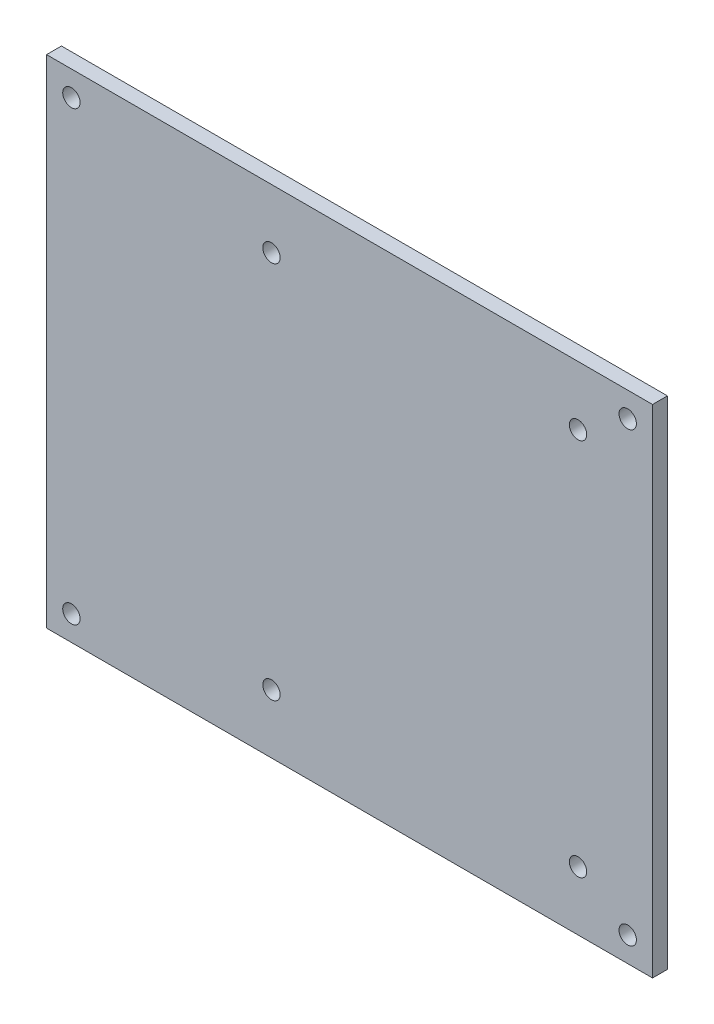
ISO-10303-21;
HEADER;
FILE_DESCRIPTION(('STEP AP214'),'2;1');
FILE_NAME('part.step','',(''),(''),'','','');
FILE_SCHEMA(('AUTOMOTIVE_DESIGN { 1 0 10303 214 1 1 1 1 }'));
ENDSEC;
DATA;
#1=APPLICATION_CONTEXT('core data for automotive mechanical design processes');
#2=APPLICATION_PROTOCOL_DEFINITION('international standard','automotive_design',2000,#1);
#3=PRODUCT_CONTEXT('',#1,'mechanical');
#4=PRODUCT('Part','Part','',(#3));
#5=PRODUCT_RELATED_PRODUCT_CATEGORY('part','',(#4));
#6=PRODUCT_DEFINITION_FORMATION('','',#4);
#7=PRODUCT_DEFINITION_CONTEXT('part definition',#1,'design');
#8=PRODUCT_DEFINITION('design','',#6,#7);
#9=PRODUCT_DEFINITION_SHAPE('','',#8);
#10=(LENGTH_UNIT() NAMED_UNIT(*) SI_UNIT(.MILLI.,.METRE.));
#11=(NAMED_UNIT(*) PLANE_ANGLE_UNIT() SI_UNIT($,.RADIAN.));
#12=(NAMED_UNIT(*) SI_UNIT($,.STERADIAN.) SOLID_ANGLE_UNIT());
#13=UNCERTAINTY_MEASURE_WITH_UNIT(LENGTH_MEASURE(1.E-05),#10,'distance_accuracy_value','');
#14=(GEOMETRIC_REPRESENTATION_CONTEXT(3) GLOBAL_UNCERTAINTY_ASSIGNED_CONTEXT((#13)) GLOBAL_UNIT_ASSIGNED_CONTEXT((#10,
#11,#12)) REPRESENTATION_CONTEXT('',''));
#15=CARTESIAN_POINT('',(0.,0.,0.));
#16=DIRECTION('',(0.,0.,1.));
#17=DIRECTION('',(1.,0.,0.));
#18=AXIS2_PLACEMENT_3D('',#15,#16,#17);
#19=CARTESIAN_POINT('',(0.,0.,3.));
#20=DIRECTION('',(0.,0.,1.));
#21=DIRECTION('',(1.,0.,0.));
#22=AXIS2_PLACEMENT_3D('',#19,#20,#21);
#23=PLANE('',#22);
#24=CARTESIAN_POINT('',(-15.72,38.1,3.));
#25=DIRECTION('',(0.,0.,1.));
#26=DIRECTION('',(1.,0.,0.));
#27=AXIS2_PLACEMENT_3D('',#24,#25,#26);
#28=CIRCLE('',#27,1.75);
#29=CARTESIAN_POINT('',(-13.97,38.1,3.));
#30=VERTEX_POINT('',#29);
#31=EDGE_CURVE('E151',#30,#30,#28,.T.);
#32=ORIENTED_EDGE('',*,*,#31,.F.);
#33=EDGE_LOOP('',(#32));
#34=FACE_BOUND('',#33,.T.);
#35=CARTESIAN_POINT('',(46.,38.1,3.));
#36=DIRECTION('',(0.,0.,1.));
#37=DIRECTION('',(1.,0.,0.));
#38=AXIS2_PLACEMENT_3D('',#35,#36,#37);
#39=CIRCLE('',#38,1.75);
#40=CARTESIAN_POINT('',(47.75,38.1,3.));
#41=VERTEX_POINT('',#40);
#42=EDGE_CURVE('E137',#41,#41,#39,.T.);
#43=ORIENTED_EDGE('',*,*,#42,.F.);
#44=EDGE_LOOP('',(#43));
#45=FACE_BOUND('',#44,.T.);
#46=CARTESIAN_POINT('',(56.,-45.,3.));
#47=DIRECTION('',(0.,0.,1.));
#48=DIRECTION('',(1.,0.,0.));
#49=AXIS2_PLACEMENT_3D('',#46,#47,#48);
#50=CIRCLE('',#49,1.75);
#51=CARTESIAN_POINT('',(57.75,-45.,3.));
#52=VERTEX_POINT('',#51);
#53=EDGE_CURVE('E130',#52,#52,#50,.T.);
#54=ORIENTED_EDGE('',*,*,#53,.F.);
#55=EDGE_LOOP('',(#54));
#56=FACE_BOUND('',#55,.T.);
#57=CARTESIAN_POINT('',(-56.,-45.,3.));
#58=DIRECTION('',(0.,0.,1.));
#59=DIRECTION('',(1.,0.,0.));
#60=AXIS2_PLACEMENT_3D('',#57,#58,#59);
#61=CIRCLE('',#60,1.75);
#62=CARTESIAN_POINT('',(-54.25,-45.,3.));
#63=VERTEX_POINT('',#62);
#64=EDGE_CURVE('E106',#63,#63,#61,.T.);
#65=ORIENTED_EDGE('',*,*,#64,.F.);
#66=EDGE_LOOP('',(#65));
#67=FACE_BOUND('',#66,.T.);
#68=DIRECTION('',(1.,0.,0.));
#69=VECTOR('',#68,1.);
#70=CARTESIAN_POINT('',(61.,-50.,3.));
#71=LINE('',#70,#69);
#72=CARTESIAN_POINT('',(-61.,-50.,3.));
#73=VERTEX_POINT('',#72);
#74=CARTESIAN_POINT('',(61.,-50.,3.));
#75=VERTEX_POINT('',#74);
#76=EDGE_CURVE('E91',#73,#75,#71,.T.);
#77=ORIENTED_EDGE('',*,*,#76,.T.);
#78=DIRECTION('',(0.,1.,0.));
#79=VECTOR('',#78,1.);
#80=CARTESIAN_POINT('',(61.,50.,3.));
#81=LINE('',#80,#79);
#82=CARTESIAN_POINT('',(61.,50.,3.));
#83=VERTEX_POINT('',#82);
#84=EDGE_CURVE('E86',#75,#83,#81,.T.);
#85=ORIENTED_EDGE('',*,*,#84,.T.);
#86=DIRECTION('',(-1.,0.,0.));
#87=VECTOR('',#86,1.);
#88=CARTESIAN_POINT('',(61.,50.,3.));
#89=LINE('',#88,#87);
#90=CARTESIAN_POINT('',(-61.,50.,3.));
#91=VERTEX_POINT('',#90);
#92=EDGE_CURVE('E87',#83,#91,#89,.T.);
#93=ORIENTED_EDGE('',*,*,#92,.T.);
#94=DIRECTION('',(0.,-1.,0.));
#95=VECTOR('',#94,1.);
#96=CARTESIAN_POINT('',(-61.,50.,3.));
#97=LINE('',#96,#95);
#98=EDGE_CURVE('E57',#91,#73,#97,.T.);
#99=ORIENTED_EDGE('',*,*,#98,.T.);
#100=EDGE_LOOP('',(#77,#85,#93,#99));
#101=FACE_BOUND('',#100,.T.);
#102=CARTESIAN_POINT('',(-56.,45.,3.));
#103=DIRECTION('',(0.,0.,1.));
#104=DIRECTION('',(1.,0.,0.));
#105=AXIS2_PLACEMENT_3D('',#102,#103,#104);
#106=CIRCLE('',#105,1.75);
#107=CARTESIAN_POINT('',(-54.25,45.,3.));
#108=VERTEX_POINT('',#107);
#109=EDGE_CURVE('E123',#108,#108,#106,.T.);
#110=ORIENTED_EDGE('',*,*,#109,.F.);
#111=EDGE_LOOP('',(#110));
#112=FACE_BOUND('',#111,.T.);
#113=CARTESIAN_POINT('',(56.,45.,3.));
#114=DIRECTION('',(0.,0.,1.));
#115=DIRECTION('',(1.,0.,0.));
#116=AXIS2_PLACEMENT_3D('',#113,#114,#115);
#117=CIRCLE('',#116,1.75);
#118=CARTESIAN_POINT('',(57.75,45.,3.));
#119=VERTEX_POINT('',#118);
#120=EDGE_CURVE('E133',#119,#119,#117,.T.);
#121=ORIENTED_EDGE('',*,*,#120,.F.);
#122=EDGE_LOOP('',(#121));
#123=FACE_BOUND('',#122,.T.);
#124=CARTESIAN_POINT('',(-15.72,-38.1,3.));
#125=DIRECTION('',(0.,0.,1.));
#126=DIRECTION('',(1.,0.,0.));
#127=AXIS2_PLACEMENT_3D('',#124,#125,#126);
#128=CIRCLE('',#127,1.75);
#129=CARTESIAN_POINT('',(-13.97,-38.1,3.));
#130=VERTEX_POINT('',#129);
#131=EDGE_CURVE('E144',#130,#130,#128,.T.);
#132=ORIENTED_EDGE('',*,*,#131,.F.);
#133=EDGE_LOOP('',(#132));
#134=FACE_BOUND('',#133,.T.);
#135=CARTESIAN_POINT('',(46.,-38.1,3.));
#136=DIRECTION('',(0.,0.,1.));
#137=DIRECTION('',(1.,0.,0.));
#138=AXIS2_PLACEMENT_3D('',#135,#136,#137);
#139=CIRCLE('',#138,1.75);
#140=CARTESIAN_POINT('',(47.75,-38.1,3.));
#141=VERTEX_POINT('',#140);
#142=EDGE_CURVE('E160',#141,#141,#139,.T.);
#143=ORIENTED_EDGE('',*,*,#142,.F.);
#144=EDGE_LOOP('',(#143));
#145=FACE_BOUND('',#144,.T.);
#146=ADVANCED_FACE('F39',(#34,#45,#56,#67,#101,#112,#123,#134,#145),#23,.T.);
#147=CARTESIAN_POINT('',(0.,0.,0.));
#148=DIRECTION('',(0.,0.,1.));
#149=DIRECTION('',(1.,0.,0.));
#150=AXIS2_PLACEMENT_3D('',#147,#148,#149);
#151=PLANE('',#150);
#152=DIRECTION('',(1.,0.,0.));
#153=VECTOR('',#152,1.);
#154=CARTESIAN_POINT('',(61.,-50.,0.));
#155=LINE('',#154,#153);
#156=CARTESIAN_POINT('',(-61.,-50.,0.));
#157=VERTEX_POINT('',#156);
#158=CARTESIAN_POINT('',(61.,-50.,0.));
#159=VERTEX_POINT('',#158);
#160=EDGE_CURVE('E104',#157,#159,#155,.T.);
#161=ORIENTED_EDGE('',*,*,#160,.F.);
#162=DIRECTION('',(0.,-1.,0.));
#163=VECTOR('',#162,1.);
#164=CARTESIAN_POINT('',(-61.,50.,0.));
#165=LINE('',#164,#163);
#166=CARTESIAN_POINT('',(-61.,50.,0.));
#167=VERTEX_POINT('',#166);
#168=EDGE_CURVE('E80',#167,#157,#165,.T.);
#169=ORIENTED_EDGE('',*,*,#168,.F.);
#170=DIRECTION('',(-1.,0.,0.));
#171=VECTOR('',#170,1.);
#172=CARTESIAN_POINT('',(61.,50.,0.));
#173=LINE('',#172,#171);
#174=CARTESIAN_POINT('',(61.,50.,0.));
#175=VERTEX_POINT('',#174);
#176=EDGE_CURVE('E74',#175,#167,#173,.T.);
#177=ORIENTED_EDGE('',*,*,#176,.F.);
#178=DIRECTION('',(0.,1.,0.));
#179=VECTOR('',#178,1.);
#180=CARTESIAN_POINT('',(61.,50.,0.));
#181=LINE('',#180,#179);
#182=EDGE_CURVE('E94',#159,#175,#181,.T.);
#183=ORIENTED_EDGE('',*,*,#182,.F.);
#184=EDGE_LOOP('',(#161,#169,#177,#183));
#185=FACE_BOUND('',#184,.T.);
#186=CARTESIAN_POINT('',(-56.,-45.,0.));
#187=DIRECTION('',(0.,0.,1.));
#188=DIRECTION('',(1.,0.,0.));
#189=AXIS2_PLACEMENT_3D('',#186,#187,#188);
#190=CIRCLE('',#189,1.75);
#191=CARTESIAN_POINT('',(-54.25,-45.,0.));
#192=VERTEX_POINT('',#191);
#193=EDGE_CURVE('E119',#192,#192,#190,.T.);
#194=ORIENTED_EDGE('',*,*,#193,.T.);
#195=EDGE_LOOP('',(#194));
#196=FACE_BOUND('',#195,.T.);
#197=CARTESIAN_POINT('',(-56.,45.,0.));
#198=DIRECTION('',(0.,0.,1.));
#199=DIRECTION('',(1.,0.,0.));
#200=AXIS2_PLACEMENT_3D('',#197,#198,#199);
#201=CIRCLE('',#200,1.75);
#202=CARTESIAN_POINT('',(-54.25,45.,0.));
#203=VERTEX_POINT('',#202);
#204=EDGE_CURVE('E125',#203,#203,#201,.T.);
#205=ORIENTED_EDGE('',*,*,#204,.T.);
#206=EDGE_LOOP('',(#205));
#207=FACE_BOUND('',#206,.T.);
#208=CARTESIAN_POINT('',(56.,-45.,0.));
#209=DIRECTION('',(0.,0.,1.));
#210=DIRECTION('',(1.,0.,0.));
#211=AXIS2_PLACEMENT_3D('',#208,#209,#210);
#212=CIRCLE('',#211,1.75);
#213=CARTESIAN_POINT('',(57.75,-45.,0.));
#214=VERTEX_POINT('',#213);
#215=EDGE_CURVE('E127',#214,#214,#212,.T.);
#216=ORIENTED_EDGE('',*,*,#215,.T.);
#217=EDGE_LOOP('',(#216));
#218=FACE_BOUND('',#217,.T.);
#219=CARTESIAN_POINT('',(56.,45.,0.));
#220=DIRECTION('',(0.,0.,1.));
#221=DIRECTION('',(1.,0.,0.));
#222=AXIS2_PLACEMENT_3D('',#219,#220,#221);
#223=CIRCLE('',#222,1.75);
#224=CARTESIAN_POINT('',(57.75,45.,0.));
#225=VERTEX_POINT('',#224);
#226=EDGE_CURVE('E136',#225,#225,#223,.T.);
#227=ORIENTED_EDGE('',*,*,#226,.T.);
#228=EDGE_LOOP('',(#227));
#229=FACE_BOUND('',#228,.T.);
#230=CARTESIAN_POINT('',(46.,38.1,0.));
#231=DIRECTION('',(0.,0.,1.));
#232=DIRECTION('',(1.,0.,0.));
#233=AXIS2_PLACEMENT_3D('',#230,#231,#232);
#234=CIRCLE('',#233,1.75);
#235=CARTESIAN_POINT('',(47.75,38.1,0.));
#236=VERTEX_POINT('',#235);
#237=EDGE_CURVE('E145',#236,#236,#234,.T.);
#238=ORIENTED_EDGE('',*,*,#237,.T.);
#239=EDGE_LOOP('',(#238));
#240=FACE_BOUND('',#239,.T.);
#241=CARTESIAN_POINT('',(-15.72,-38.1,0.));
#242=DIRECTION('',(0.,0.,1.));
#243=DIRECTION('',(1.,0.,0.));
#244=AXIS2_PLACEMENT_3D('',#241,#242,#243);
#245=CIRCLE('',#244,1.75);
#246=CARTESIAN_POINT('',(-13.97,-38.1,0.));
#247=VERTEX_POINT('',#246);
#248=EDGE_CURVE('E149',#247,#247,#245,.T.);
#249=ORIENTED_EDGE('',*,*,#248,.T.);
#250=EDGE_LOOP('',(#249));
#251=FACE_BOUND('',#250,.T.);
#252=CARTESIAN_POINT('',(-15.72,38.1,0.));
#253=DIRECTION('',(0.,0.,1.));
#254=DIRECTION('',(1.,0.,0.));
#255=AXIS2_PLACEMENT_3D('',#252,#253,#254);
#256=CIRCLE('',#255,1.75);
#257=CARTESIAN_POINT('',(-13.97,38.1,0.));
#258=VERTEX_POINT('',#257);
#259=EDGE_CURVE('E153',#258,#258,#256,.T.);
#260=ORIENTED_EDGE('',*,*,#259,.T.);
#261=EDGE_LOOP('',(#260));
#262=FACE_BOUND('',#261,.T.);
#263=CARTESIAN_POINT('',(46.,-38.1,0.));
#264=DIRECTION('',(0.,0.,1.));
#265=DIRECTION('',(1.,0.,0.));
#266=AXIS2_PLACEMENT_3D('',#263,#264,#265);
#267=CIRCLE('',#266,1.75);
#268=CARTESIAN_POINT('',(47.75,-38.1,0.));
#269=VERTEX_POINT('',#268);
#270=EDGE_CURVE('E158',#269,#269,#267,.T.);
#271=ORIENTED_EDGE('',*,*,#270,.T.);
#272=EDGE_LOOP('',(#271));
#273=FACE_BOUND('',#272,.T.);
#274=ADVANCED_FACE('F114',(#185,#196,#207,#218,#229,#240,#251,#262,#273),#151,.F.);
#275=CARTESIAN_POINT('',(61.,-50.,3.));
#276=DIRECTION('',(0.,1.,0.));
#277=DIRECTION('',(0.,0.,1.));
#278=AXIS2_PLACEMENT_3D('',#275,#276,#277);
#279=PLANE('',#278);
#280=ORIENTED_EDGE('',*,*,#160,.T.);
#281=DIRECTION('',(0.,0.,-1.));
#282=VECTOR('',#281,1.);
#283=CARTESIAN_POINT('',(61.,-50.,3.));
#284=LINE('',#283,#282);
#285=EDGE_CURVE('E11',#75,#159,#284,.T.);
#286=ORIENTED_EDGE('',*,*,#285,.F.);
#287=ORIENTED_EDGE('',*,*,#76,.F.);
#288=DIRECTION('',(0.,0.,-1.));
#289=VECTOR('',#288,1.);
#290=CARTESIAN_POINT('',(-61.,-50.,3.));
#291=LINE('',#290,#289);
#292=EDGE_CURVE('E98',#73,#157,#291,.T.);
#293=ORIENTED_EDGE('',*,*,#292,.T.);
#294=EDGE_LOOP('',(#280,#286,#287,#293));
#295=FACE_BOUND('',#294,.T.);
#296=ADVANCED_FACE('F41',(#295),#279,.F.);
#297=CARTESIAN_POINT('',(61.,50.,3.));
#298=DIRECTION('',(-1.,0.,0.));
#299=DIRECTION('',(0.,-1.,0.));
#300=AXIS2_PLACEMENT_3D('',#297,#298,#299);
#301=PLANE('',#300);
#302=ORIENTED_EDGE('',*,*,#182,.T.);
#303=DIRECTION('',(0.,0.,-1.));
#304=VECTOR('',#303,1.);
#305=CARTESIAN_POINT('',(61.,50.,3.));
#306=LINE('',#305,#304);
#307=EDGE_CURVE('E48',#83,#175,#306,.T.);
#308=ORIENTED_EDGE('',*,*,#307,.F.);
#309=ORIENTED_EDGE('',*,*,#84,.F.);
#310=ORIENTED_EDGE('',*,*,#285,.T.);
#311=EDGE_LOOP('',(#302,#308,#309,#310));
#312=FACE_BOUND('',#311,.T.);
#313=ADVANCED_FACE('F92',(#312),#301,.F.);
#314=CARTESIAN_POINT('',(61.,50.,3.));
#315=DIRECTION('',(0.,-1.,0.));
#316=DIRECTION('',(0.,0.,-1.));
#317=AXIS2_PLACEMENT_3D('',#314,#315,#316);
#318=PLANE('',#317);
#319=ORIENTED_EDGE('',*,*,#176,.T.);
#320=DIRECTION('',(0.,0.,-1.));
#321=VECTOR('',#320,1.);
#322=CARTESIAN_POINT('',(-61.,50.,3.));
#323=LINE('',#322,#321);
#324=EDGE_CURVE('E96',#91,#167,#323,.T.);
#325=ORIENTED_EDGE('',*,*,#324,.F.);
#326=ORIENTED_EDGE('',*,*,#92,.F.);
#327=ORIENTED_EDGE('',*,*,#307,.T.);
#328=EDGE_LOOP('',(#319,#325,#326,#327));
#329=FACE_BOUND('',#328,.T.);
#330=ADVANCED_FACE('F100',(#329),#318,.F.);
#331=CARTESIAN_POINT('',(-61.,50.,3.));
#332=DIRECTION('',(1.,0.,0.));
#333=DIRECTION('',(0.,1.,0.));
#334=AXIS2_PLACEMENT_3D('',#331,#332,#333);
#335=PLANE('',#334);
#336=ORIENTED_EDGE('',*,*,#168,.T.);
#337=ORIENTED_EDGE('',*,*,#292,.F.);
#338=ORIENTED_EDGE('',*,*,#98,.F.);
#339=ORIENTED_EDGE('',*,*,#324,.T.);
#340=EDGE_LOOP('',(#336,#337,#338,#339));
#341=FACE_BOUND('',#340,.T.);
#342=ADVANCED_FACE('F112',(#341),#335,.F.);
#343=CARTESIAN_POINT('',(-56.,-45.,3.));
#344=DIRECTION('',(0.,0.,-1.));
#345=DIRECTION('',(-1.,0.,0.));
#346=AXIS2_PLACEMENT_3D('',#343,#344,#345);
#347=CYLINDRICAL_SURFACE('',#346,1.75);
#348=ORIENTED_EDGE('',*,*,#64,.T.);
#349=EDGE_LOOP('',(#348));
#350=FACE_BOUND('',#349,.T.);
#351=ORIENTED_EDGE('',*,*,#193,.F.);
#352=EDGE_LOOP('',(#351));
#353=FACE_BOUND('',#352,.T.);
#354=ADVANCED_FACE('F177',(#350,#353),#347,.F.);
#355=CARTESIAN_POINT('',(-56.,45.,3.));
#356=DIRECTION('',(0.,0.,-1.));
#357=DIRECTION('',(-1.,0.,0.));
#358=AXIS2_PLACEMENT_3D('',#355,#356,#357);
#359=CYLINDRICAL_SURFACE('',#358,1.75);
#360=ORIENTED_EDGE('',*,*,#109,.T.);
#361=EDGE_LOOP('',(#360));
#362=FACE_BOUND('',#361,.T.);
#363=ORIENTED_EDGE('',*,*,#204,.F.);
#364=EDGE_LOOP('',(#363));
#365=FACE_BOUND('',#364,.T.);
#366=ADVANCED_FACE('F222',(#362,#365),#359,.F.);
#367=CARTESIAN_POINT('',(56.,-45.,3.));
#368=DIRECTION('',(0.,0.,-1.));
#369=DIRECTION('',(-1.,0.,0.));
#370=AXIS2_PLACEMENT_3D('',#367,#368,#369);
#371=CYLINDRICAL_SURFACE('',#370,1.75);
#372=ORIENTED_EDGE('',*,*,#53,.T.);
#373=EDGE_LOOP('',(#372));
#374=FACE_BOUND('',#373,.T.);
#375=ORIENTED_EDGE('',*,*,#215,.F.);
#376=EDGE_LOOP('',(#375));
#377=FACE_BOUND('',#376,.T.);
#378=ADVANCED_FACE('F235',(#374,#377),#371,.F.);
#379=CARTESIAN_POINT('',(56.,45.,3.));
#380=DIRECTION('',(0.,0.,-1.));
#381=DIRECTION('',(-1.,0.,0.));
#382=AXIS2_PLACEMENT_3D('',#379,#380,#381);
#383=CYLINDRICAL_SURFACE('',#382,1.75);
#384=ORIENTED_EDGE('',*,*,#120,.T.);
#385=EDGE_LOOP('',(#384));
#386=FACE_BOUND('',#385,.T.);
#387=ORIENTED_EDGE('',*,*,#226,.F.);
#388=EDGE_LOOP('',(#387));
#389=FACE_BOUND('',#388,.T.);
#390=ADVANCED_FACE('F238',(#386,#389),#383,.F.);
#391=CARTESIAN_POINT('',(46.,38.1,3.));
#392=DIRECTION('',(0.,0.,-1.));
#393=DIRECTION('',(-1.,0.,0.));
#394=AXIS2_PLACEMENT_3D('',#391,#392,#393);
#395=CYLINDRICAL_SURFACE('',#394,1.75);
#396=ORIENTED_EDGE('',*,*,#42,.T.);
#397=EDGE_LOOP('',(#396));
#398=FACE_BOUND('',#397,.T.);
#399=ORIENTED_EDGE('',*,*,#237,.F.);
#400=EDGE_LOOP('',(#399));
#401=FACE_BOUND('',#400,.T.);
#402=ADVANCED_FACE('F249',(#398,#401),#395,.F.);
#403=CARTESIAN_POINT('',(-15.72,-38.1,3.));
#404=DIRECTION('',(0.,0.,-1.));
#405=DIRECTION('',(-1.,0.,0.));
#406=AXIS2_PLACEMENT_3D('',#403,#404,#405);
#407=CYLINDRICAL_SURFACE('',#406,1.75);
#408=ORIENTED_EDGE('',*,*,#131,.T.);
#409=EDGE_LOOP('',(#408));
#410=FACE_BOUND('',#409,.T.);
#411=ORIENTED_EDGE('',*,*,#248,.F.);
#412=EDGE_LOOP('',(#411));
#413=FACE_BOUND('',#412,.T.);
#414=ADVANCED_FACE('F256',(#410,#413),#407,.F.);
#415=CARTESIAN_POINT('',(-15.72,38.1,3.));
#416=DIRECTION('',(0.,0.,-1.));
#417=DIRECTION('',(-1.,0.,0.));
#418=AXIS2_PLACEMENT_3D('',#415,#416,#417);
#419=CYLINDRICAL_SURFACE('',#418,1.75);
#420=ORIENTED_EDGE('',*,*,#31,.T.);
#421=EDGE_LOOP('',(#420));
#422=FACE_BOUND('',#421,.T.);
#423=ORIENTED_EDGE('',*,*,#259,.F.);
#424=EDGE_LOOP('',(#423));
#425=FACE_BOUND('',#424,.T.);
#426=ADVANCED_FACE('F270',(#422,#425),#419,.F.);
#427=CARTESIAN_POINT('',(46.,-38.1,3.));
#428=DIRECTION('',(0.,0.,-1.));
#429=DIRECTION('',(-1.,0.,0.));
#430=AXIS2_PLACEMENT_3D('',#427,#428,#429);
#431=CYLINDRICAL_SURFACE('',#430,1.75);
#432=ORIENTED_EDGE('',*,*,#142,.T.);
#433=EDGE_LOOP('',(#432));
#434=FACE_BOUND('',#433,.T.);
#435=ORIENTED_EDGE('',*,*,#270,.F.);
#436=EDGE_LOOP('',(#435));
#437=FACE_BOUND('',#436,.T.);
#438=ADVANCED_FACE('F168',(#434,#437),#431,.F.);
#439=CLOSED_SHELL('',(#146,#274,#296,#313,#330,#342,#354,#366,#378,#390,#402,#414,#426,#438));
#440=MANIFOLD_SOLID_BREP('B2',#439);
#441=ADVANCED_BREP_SHAPE_REPRESENTATION('',(#18,#440),#14);
#442=SHAPE_DEFINITION_REPRESENTATION(#9,#441);
ENDSEC;
END-ISO-10303-21;
